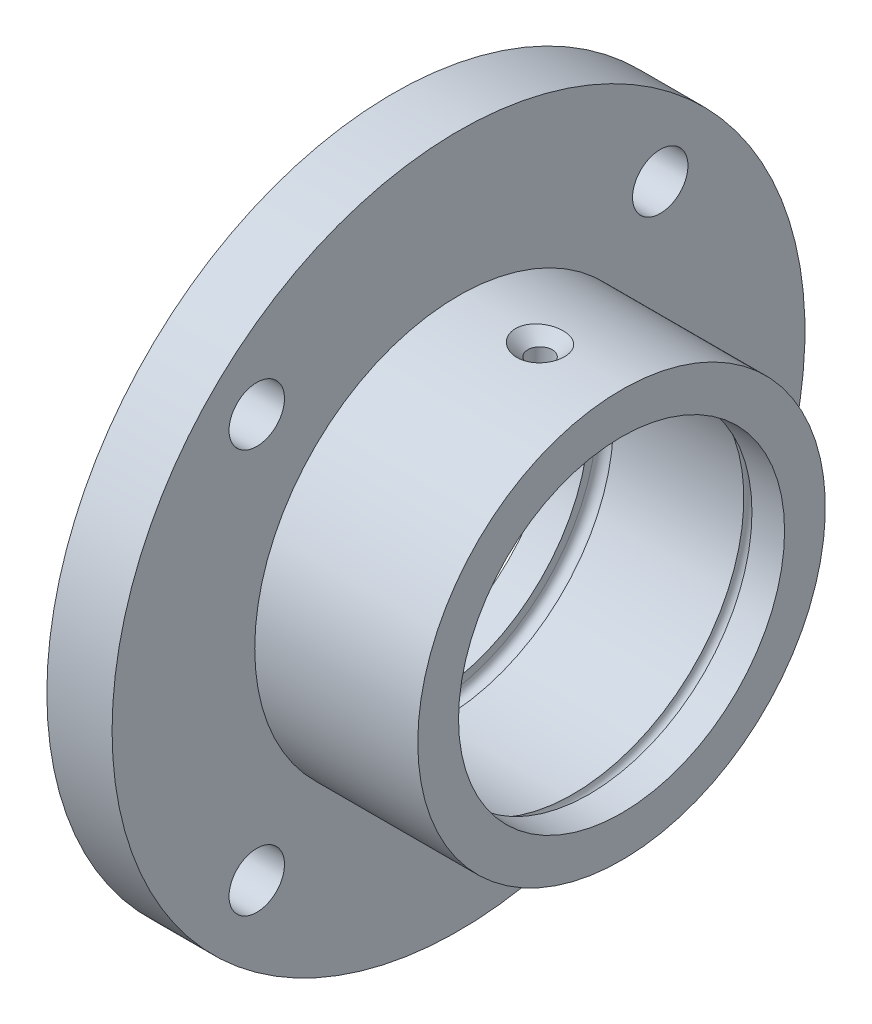
ISO-10303-21;
HEADER;
FILE_DESCRIPTION(('STEP AP214'),'2;1');
FILE_NAME('part.step','',(''),(''),'','','');
FILE_SCHEMA(('AUTOMOTIVE_DESIGN { 1 0 10303 214 1 1 1 1 }'));
ENDSEC;
DATA;
#1=APPLICATION_CONTEXT('core data for automotive mechanical design processes');
#2=APPLICATION_PROTOCOL_DEFINITION('international standard','automotive_design',2000,#1);
#3=PRODUCT_CONTEXT('',#1,'mechanical');
#4=PRODUCT('Part','Part','',(#3));
#5=PRODUCT_RELATED_PRODUCT_CATEGORY('part','',(#4));
#6=PRODUCT_DEFINITION_FORMATION('','',#4);
#7=PRODUCT_DEFINITION_CONTEXT('part definition',#1,'design');
#8=PRODUCT_DEFINITION('design','',#6,#7);
#9=PRODUCT_DEFINITION_SHAPE('','',#8);
#10=(LENGTH_UNIT() NAMED_UNIT(*) SI_UNIT(.MILLI.,.METRE.));
#11=(NAMED_UNIT(*) PLANE_ANGLE_UNIT() SI_UNIT($,.RADIAN.));
#12=(NAMED_UNIT(*) SI_UNIT($,.STERADIAN.) SOLID_ANGLE_UNIT());
#13=UNCERTAINTY_MEASURE_WITH_UNIT(LENGTH_MEASURE(1.E-05),#10,'distance_accuracy_value','');
#14=(GEOMETRIC_REPRESENTATION_CONTEXT(3) GLOBAL_UNCERTAINTY_ASSIGNED_CONTEXT((#13)) GLOBAL_UNIT_ASSIGNED_CONTEXT((#10,
#11,#12)) REPRESENTATION_CONTEXT('',''));
#15=CARTESIAN_POINT('',(0.,0.,0.));
#16=DIRECTION('',(0.,0.,1.));
#17=DIRECTION('',(1.,0.,0.));
#18=AXIS2_PLACEMENT_3D('',#15,#16,#17);
#19=CARTESIAN_POINT('',(0.,0.,0.));
#20=DIRECTION('',(1.,0.,0.));
#21=DIRECTION('',(0.,0.,-1.));
#22=AXIS2_PLACEMENT_3D('',#19,#20,#21);
#23=PLANE('',#22);
#24=CARTESIAN_POINT('',(0.,-24.748737341529,24.7487373415293));
#25=DIRECTION('',(-1.,0.,0.));
#26=DIRECTION('',(0.,0.,1.));
#27=AXIS2_PLACEMENT_3D('',#24,#25,#26);
#28=CIRCLE('',#27,4.025);
#29=CARTESIAN_POINT('',(0.,-24.748737341529,28.7737373415293));
#30=VERTEX_POINT('',#29);
#31=EDGE_CURVE('E180',#30,#30,#28,.T.);
#32=ORIENTED_EDGE('',*,*,#31,.F.);
#33=EDGE_LOOP('',(#32));
#34=FACE_BOUND('',#33,.T.);
#35=CARTESIAN_POINT('',(0.,-24.748737341529,-24.7487373415293));
#36=DIRECTION('',(-1.,0.,0.));
#37=DIRECTION('',(0.,0.,1.));
#38=AXIS2_PLACEMENT_3D('',#35,#36,#37);
#39=CIRCLE('',#38,4.025);
#40=CARTESIAN_POINT('',(0.,-24.748737341529,-20.7237373415293));
#41=VERTEX_POINT('',#40);
#42=EDGE_CURVE('E184',#41,#41,#39,.T.);
#43=ORIENTED_EDGE('',*,*,#42,.F.);
#44=EDGE_LOOP('',(#43));
#45=FACE_BOUND('',#44,.T.);
#46=CARTESIAN_POINT('',(0.,24.7487373415292,-24.7487373415291));
#47=DIRECTION('',(-1.,0.,0.));
#48=DIRECTION('',(0.,0.,1.));
#49=AXIS2_PLACEMENT_3D('',#46,#47,#48);
#50=CIRCLE('',#49,4.025);
#51=CARTESIAN_POINT('',(0.,24.7487373415292,-20.7237373415291));
#52=VERTEX_POINT('',#51);
#53=EDGE_CURVE('E188',#52,#52,#50,.T.);
#54=ORIENTED_EDGE('',*,*,#53,.F.);
#55=EDGE_LOOP('',(#54));
#56=FACE_BOUND('',#55,.T.);
#57=CARTESIAN_POINT('',(0.,24.748737341529,24.7487373415293));
#58=DIRECTION('',(-1.,0.,0.));
#59=DIRECTION('',(0.,0.,1.));
#60=AXIS2_PLACEMENT_3D('',#57,#58,#59);
#61=CIRCLE('',#60,4.025);
#62=CARTESIAN_POINT('',(0.,24.748737341529,28.7737373415293));
#63=VERTEX_POINT('',#62);
#64=EDGE_CURVE('E192',#63,#63,#61,.T.);
#65=ORIENTED_EDGE('',*,*,#64,.F.);
#66=EDGE_LOOP('',(#65));
#67=FACE_BOUND('',#66,.T.);
#68=CARTESIAN_POINT('',(0.,0.,0.));
#69=DIRECTION('',(-1.,0.,0.));
#70=DIRECTION('',(0.,0.,1.));
#71=AXIS2_PLACEMENT_3D('',#68,#69,#70);
#72=CIRCLE('',#71,20.);
#73=CARTESIAN_POINT('',(0.,0.,20.));
#74=VERTEX_POINT('',#73);
#75=EDGE_CURVE('E103',#74,#74,#72,.T.);
#76=ORIENTED_EDGE('',*,*,#75,.F.);
#77=EDGE_LOOP('',(#76));
#78=FACE_BOUND('',#77,.T.);
#79=CARTESIAN_POINT('',(0.,0.,0.));
#80=DIRECTION('',(-1.,0.,0.));
#81=DIRECTION('',(0.,0.,1.));
#82=AXIS2_PLACEMENT_3D('',#79,#80,#81);
#83=CIRCLE('',#82,42.5);
#84=CARTESIAN_POINT('',(0.,0.,42.5));
#85=VERTEX_POINT('',#84);
#86=EDGE_CURVE('E57',#85,#85,#83,.T.);
#87=ORIENTED_EDGE('',*,*,#86,.T.);
#88=EDGE_LOOP('',(#87));
#89=FACE_BOUND('',#88,.T.);
#90=ADVANCED_FACE('F49',(#34,#45,#56,#67,#78,#89),#23,.F.);
#91=CARTESIAN_POINT('',(0.,0.,0.));
#92=DIRECTION('',(-1.,0.,0.));
#93=DIRECTION('',(0.,0.,1.));
#94=AXIS2_PLACEMENT_3D('',#91,#92,#93);
#95=CYLINDRICAL_SURFACE('',#94,42.5);
#96=ORIENTED_EDGE('',*,*,#86,.F.);
#97=EDGE_LOOP('',(#96));
#98=FACE_BOUND('',#97,.T.);
#99=CARTESIAN_POINT('',(8.,0.,0.));
#100=DIRECTION('',(-1.,0.,0.));
#101=DIRECTION('',(0.,0.,1.));
#102=AXIS2_PLACEMENT_3D('',#99,#100,#101);
#103=CIRCLE('',#102,42.5);
#104=CARTESIAN_POINT('',(8.,0.,42.5));
#105=VERTEX_POINT('',#104);
#106=EDGE_CURVE('E63',#105,#105,#103,.T.);
#107=ORIENTED_EDGE('',*,*,#106,.T.);
#108=EDGE_LOOP('',(#107));
#109=FACE_BOUND('',#108,.T.);
#110=ADVANCED_FACE('F148',(#98,#109),#95,.T.);
#111=CARTESIAN_POINT('',(8.,42.5,0.));
#112=DIRECTION('',(-1.,0.,0.));
#113=DIRECTION('',(0.,0.,1.));
#114=AXIS2_PLACEMENT_3D('',#111,#112,#113);
#115=PLANE('',#114);
#116=CARTESIAN_POINT('',(8.,-24.748737341529,24.7487373415293));
#117=DIRECTION('',(-1.,0.,0.));
#118=DIRECTION('',(0.,0.,1.));
#119=AXIS2_PLACEMENT_3D('',#116,#117,#118);
#120=CIRCLE('',#119,3.39999999999999);
#121=CARTESIAN_POINT('',(8.,-24.748737341529,28.1487373415293));
#122=VERTEX_POINT('',#121);
#123=EDGE_CURVE('E52',#122,#122,#120,.T.);
#124=ORIENTED_EDGE('',*,*,#123,.T.);
#125=EDGE_LOOP('',(#124));
#126=FACE_BOUND('',#125,.T.);
#127=CARTESIAN_POINT('',(8.,-24.748737341529,-24.7487373415293));
#128=DIRECTION('',(-1.,0.,0.));
#129=DIRECTION('',(0.,0.,1.));
#130=AXIS2_PLACEMENT_3D('',#127,#128,#129);
#131=CIRCLE('',#130,3.39999999999999);
#132=CARTESIAN_POINT('',(8.,-24.748737341529,-21.3487373415293));
#133=VERTEX_POINT('',#132);
#134=EDGE_CURVE('E420',#133,#133,#131,.T.);
#135=ORIENTED_EDGE('',*,*,#134,.T.);
#136=EDGE_LOOP('',(#135));
#137=FACE_BOUND('',#136,.T.);
#138=CARTESIAN_POINT('',(8.,24.7487373415292,-24.7487373415291));
#139=DIRECTION('',(-1.,0.,0.));
#140=DIRECTION('',(0.,0.,1.));
#141=AXIS2_PLACEMENT_3D('',#138,#139,#140);
#142=CIRCLE('',#141,3.39999999999999);
#143=CARTESIAN_POINT('',(8.,24.7487373415292,-21.3487373415291));
#144=VERTEX_POINT('',#143);
#145=EDGE_CURVE('E428',#144,#144,#142,.T.);
#146=ORIENTED_EDGE('',*,*,#145,.T.);
#147=EDGE_LOOP('',(#146));
#148=FACE_BOUND('',#147,.T.);
#149=CARTESIAN_POINT('',(8.,24.748737341529,24.7487373415293));
#150=DIRECTION('',(-1.,0.,0.));
#151=DIRECTION('',(0.,0.,1.));
#152=AXIS2_PLACEMENT_3D('',#149,#150,#151);
#153=CIRCLE('',#152,3.39999999999999);
#154=CARTESIAN_POINT('',(8.,24.748737341529,28.1487373415293));
#155=VERTEX_POINT('',#154);
#156=EDGE_CURVE('E72',#155,#155,#153,.T.);
#157=ORIENTED_EDGE('',*,*,#156,.T.);
#158=EDGE_LOOP('',(#157));
#159=FACE_BOUND('',#158,.T.);
#160=ORIENTED_EDGE('',*,*,#106,.F.);
#161=EDGE_LOOP('',(#160));
#162=FACE_BOUND('',#161,.T.);
#163=CARTESIAN_POINT('',(8.,0.,0.));
#164=DIRECTION('',(-1.,0.,0.));
#165=DIRECTION('',(0.,0.,1.));
#166=AXIS2_PLACEMENT_3D('',#163,#164,#165);
#167=CIRCLE('',#166,25.);
#168=CARTESIAN_POINT('',(8.,0.,25.));
#169=VERTEX_POINT('',#168);
#170=EDGE_CURVE('E141',#169,#169,#167,.T.);
#171=ORIENTED_EDGE('',*,*,#170,.T.);
#172=EDGE_LOOP('',(#171));
#173=FACE_BOUND('',#172,.T.);
#174=ADVANCED_FACE('F150',(#126,#137,#148,#159,#162,#173),#115,.F.);
#175=CARTESIAN_POINT('',(0.,0.,0.));
#176=DIRECTION('',(-1.,0.,0.));
#177=DIRECTION('',(0.,0.,1.));
#178=AXIS2_PLACEMENT_3D('',#175,#176,#177);
#179=CYLINDRICAL_SURFACE('',#178,25.);
#180=CARTESIAN_POINT('',(15.9365317259917,24.9150620153961,-2.05904957922023));
#181=CARTESIAN_POINT('',(16.0437107225847,24.9071157754306,-2.15520477172809));
#182=CARTESIAN_POINT('',(16.1579825974758,24.8992581419658,-2.24351052359883));
#183=CARTESIAN_POINT('',(16.3980646835025,24.8843774220917,-2.40295373031443));
#184=CARTESIAN_POINT('',(16.5238852496452,24.8773550978627,-2.47407556573222));
#185=CARTESIAN_POINT('',(16.8068841112376,24.8636282056974,-2.60870980980574));
#186=CARTESIAN_POINT('',(16.9657239841346,24.8571882442472,-2.66878347370037));
#187=CARTESIAN_POINT('',(17.2911168596524,24.8469504704821,-2.76247739758651));
#188=CARTESIAN_POINT('',(17.457672671191,24.8431536285613,-2.79608794250703));
#189=CARTESIAN_POINT('',(17.7994490402391,24.8385356387127,-2.83682898059478));
#190=CARTESIAN_POINT('',(17.9747764744444,24.8378133443776,-2.84307997726629));
#191=CARTESIAN_POINT('',(18.3240438227202,24.8396982272045,-2.82656234622219));
#192=CARTESIAN_POINT('',(18.4979836637103,24.8423055785792,-2.80379220007158));
#193=CARTESIAN_POINT('',(18.8412833945559,24.8505963405152,-2.72933520161493));
#194=CARTESIAN_POINT('',(19.0105821305259,24.8563094812074,-2.67736870386898));
#195=CARTESIAN_POINT('',(19.3378136198523,24.8701666979042,-2.54542430653609));
#196=CARTESIAN_POINT('',(19.4957463299609,24.8783107831581,-2.46544630037167));
#197=CARTESIAN_POINT('',(19.7929362610855,24.8959167385213,-2.28073929385836));
#198=CARTESIAN_POINT('',(19.9324463082021,24.9053560780482,-2.17641571982751));
#199=CARTESIAN_POINT('',(20.1909545204536,24.9245058909376,-1.94485304006585));
#200=CARTESIAN_POINT('',(20.3099573658651,24.9342163018453,-1.81761917665012));
#201=CARTESIAN_POINT('',(20.5184560288595,24.9522818566562,-1.54947724710471));
#202=CARTESIAN_POINT('',(20.6089925083573,24.9606771026206,-1.4093821252976));
#203=CARTESIAN_POINT('',(20.7636454066142,24.9755470357339,-1.11520078611881));
#204=CARTESIAN_POINT('',(20.827772635022,24.9820225083663,-0.961120324707263));
#205=CARTESIAN_POINT('',(20.924023156465,24.9919220495399,-0.652864740939115));
#206=CARTESIAN_POINT('',(20.9577691972872,24.9954996530923,-0.499200552385913));
#207=CARTESIAN_POINT('',(20.9979526060761,24.999773360494,-0.188314042065934));
#208=CARTESIAN_POINT('',(21.0043975479152,25.000470263506,-0.031092719289181));
#209=CARTESIAN_POINT('',(20.990011586111,24.998930975301,0.27586060065357));
#210=CARTESIAN_POINT('',(20.9702418009793,24.9968088849899,0.425644259255815));
#211=CARTESIAN_POINT('',(20.9060475966515,24.9900699789283,0.719755865863189));
#212=CARTESIAN_POINT('',(20.8616235630407,24.9854532021941,0.864083899155021));
#213=CARTESIAN_POINT('',(20.7495442996481,24.9742070685698,1.14398635922683));
#214=CARTESIAN_POINT('',(20.6817951565278,24.9675695884702,1.27952272539249));
#215=CARTESIAN_POINT('',(20.5254376016767,24.9529897989429,1.53787864201499));
#216=CARTESIAN_POINT('',(20.4368256129636,24.9450472658315,1.66069600656503));
#217=CARTESIAN_POINT('',(20.2373261918551,24.9283063211985,1.89579494357404));
#218=CARTESIAN_POINT('',(20.1256518890108,24.9194858783553,2.00740659367369));
#219=CARTESIAN_POINT('',(19.8859779632359,24.9022068638707,2.2114714942394));
#220=CARTESIAN_POINT('',(19.7579742717448,24.8937483831182,2.30391995496766));
#221=CARTESIAN_POINT('',(19.4817138042694,24.8775995185179,2.47237058797334));
#222=CARTESIAN_POINT('',(19.332730172835,24.8699770073704,2.54718792371623));
#223=CARTESIAN_POINT('',(19.0246144250399,24.8568788688926,2.67198870486551));
#224=CARTESIAN_POINT('',(18.8654801112175,24.8514037082761,2.72196675223152));
#225=CARTESIAN_POINT('',(18.5344269278615,24.8429973188166,2.79768096292758));
#226=CARTESIAN_POINT('',(18.362251781182,24.8401823898802,2.82231273173568));
#227=CARTESIAN_POINT('',(18.0161612346533,24.837816060436,2.8430619243428));
#228=CARTESIAN_POINT('',(17.8422456068629,24.8382650931279,2.83917556315646));
#229=CARTESIAN_POINT('',(17.4943560783235,24.8424148858173,2.80263593546425));
#230=CARTESIAN_POINT('',(17.3204360685027,24.8461732917597,2.76947266806419));
#231=CARTESIAN_POINT('',(16.9807170973922,24.8565890306788,2.67436949906663));
#232=CARTESIAN_POINT('',(16.8149184307397,24.8632464687442,2.61242855428655));
#233=CARTESIAN_POINT('',(16.4975641117529,24.8786239547148,2.46165534522482));
#234=CARTESIAN_POINT('',(16.3459153066075,24.8873289525357,2.37301803230034));
#235=CARTESIAN_POINT('',(16.0603819744962,24.9057879944435,2.17071443482601));
#236=CARTESIAN_POINT('',(15.9264949225068,24.9155418890608,2.05705171402924));
#237=CARTESIAN_POINT('',(15.6853897571733,24.9345527403733,1.81180935089952));
#238=CARTESIAN_POINT('',(15.5774189869573,24.9438153109391,1.68097128066994));
#239=CARTESIAN_POINT('',(15.3864939023304,24.9610424510707,1.40207458690901));
#240=CARTESIAN_POINT('',(15.3035301634539,24.9690075091121,1.25402248010065));
#241=CARTESIAN_POINT('',(15.1698747249061,24.9822289744927,0.953702214091301));
#242=CARTESIAN_POINT('',(15.1176499592277,24.9876109811195,0.802121862586169));
#243=CARTESIAN_POINT('',(15.0407471012562,24.9956369087427,0.49206916843793));
#244=CARTESIAN_POINT('',(15.0160587449811,24.9982818499324,0.333599416664387));
#245=CARTESIAN_POINT('',(14.9957909103458,25.0004497576838,0.0226257576214688));
#246=CARTESIAN_POINT('',(14.9988428502662,25.0001195139069,-0.129789443680718));
#247=CARTESIAN_POINT('',(15.0306736328937,24.9967256068,-0.431884818168033));
#248=CARTESIAN_POINT('',(15.0594533489792,24.9936618506758,-0.581564898328254));
#249=CARTESIAN_POINT('',(15.141155819879,24.9851956437949,-0.872328260279819));
#250=CARTESIAN_POINT('',(15.1938150825195,24.9798187491079,-1.01348679670247));
#251=CARTESIAN_POINT('',(15.3212820682627,24.9673113294873,-1.28525131875912));
#252=CARTESIAN_POINT('',(15.3960788761386,24.9601816690721,-1.41586246462921));
#253=CARTESIAN_POINT('',(15.5458547203065,24.9466602813832,-1.63502521748294));
#254=CARTESIAN_POINT('',(15.6168499963501,24.9404748936676,-1.72634893679647));
#255=CARTESIAN_POINT('',(15.7692226141498,24.927861313931,-1.89981210369311));
#256=CARTESIAN_POINT('',(15.8505973144017,24.9214331839785,-1.98195387808345));
#257=CARTESIAN_POINT('',(15.9365317259917,24.9150620153961,-2.05904957922023));
#258=B_SPLINE_CURVE_WITH_KNOTS('',3,(#180,#181,#182,#183,#184,#185,#186,#187,#188,#189,#190,
#191,#192,#193,#194,#195,#196,#197,#198,#199,#200,#201,#202,#203,#204,#205,#206,#207,#208,#209,
#210,#211,#212,#213,#214,#215,#216,#217,#218,#219,#220,#221,#222,#223,#224,#225,#226,#227,#228,
#229,#230,#231,#232,#233,#234,#235,#236,#237,#238,#239,#240,#241,#242,#243,#244,#245,#246,#247,
#248,#249,#250,#251,#252,#253,#254,#255,#256,#257),.UNSPECIFIED.,.T.,.F.,(4,2,2,2,2,2,2,2,2,2,2,
2,2,2,2,2,2,2,2,2,2,2,2,2,2,2,2,2,2,2,2,2,2,2,2,2,2,2,4),(0.,0.432311368923575,
0.865014223971844,1.37249013784755,1.88015226819742,2.40401911414544,2.92791337081323,
3.45691324391731,3.9859151297687,4.50666754981526,5.02730096275976,5.52576549483266,
6.02402579564198,6.49374647988661,6.963336845655,7.41448753769496,7.86563117406685,
8.31861290320379,8.77167235371786,9.24399357654019,9.71643271158111,10.2148672532511,
10.7134100667266,11.2328579143695,11.7523747054548,12.2811240393082,12.8098925416694,
13.3348896421596,13.8598120285305,14.3668665347407,14.8737297063696,15.3525165228815,
15.831124815636,16.286253981409,16.7413985979928,17.1916388550977,17.6416574837231,
17.9883659104411,18.3349862772387),.UNSPECIFIED.);
#259=CARTESIAN_POINT('',(15.9365317259917,24.9150620153961,-2.05904957922023));
#260=VERTEX_POINT('',#259);
#261=EDGE_CURVE('E10',#260,#260,#258,.T.);
#262=ORIENTED_EDGE('',*,*,#261,.T.);
#263=EDGE_LOOP('',(#262));
#264=FACE_BOUND('',#263,.T.);
#265=ORIENTED_EDGE('',*,*,#170,.F.);
#266=EDGE_LOOP('',(#265));
#267=FACE_BOUND('',#266,.T.);
#268=CARTESIAN_POINT('',(28.,0.,0.));
#269=DIRECTION('',(-1.,0.,0.));
#270=DIRECTION('',(0.,0.,1.));
#271=AXIS2_PLACEMENT_3D('',#268,#269,#270);
#272=CIRCLE('',#271,25.);
#273=CARTESIAN_POINT('',(28.,0.,25.));
#274=VERTEX_POINT('',#273);
#275=EDGE_CURVE('E137',#274,#274,#272,.T.);
#276=ORIENTED_EDGE('',*,*,#275,.T.);
#277=EDGE_LOOP('',(#276));
#278=FACE_BOUND('',#277,.T.);
#279=ADVANCED_FACE('F74',(#264,#267,#278),#179,.T.);
#280=CARTESIAN_POINT('',(28.,25.,0.));
#281=DIRECTION('',(-1.,0.,0.));
#282=DIRECTION('',(0.,0.,1.));
#283=AXIS2_PLACEMENT_3D('',#280,#281,#282);
#284=PLANE('',#283);
#285=CARTESIAN_POINT('',(28.,0.,0.));
#286=DIRECTION('',(-1.,0.,0.));
#287=DIRECTION('',(0.,0.,1.));
#288=AXIS2_PLACEMENT_3D('',#285,#286,#287);
#289=CIRCLE('',#288,20.);
#290=CARTESIAN_POINT('',(28.,0.,20.));
#291=VERTEX_POINT('',#290);
#292=EDGE_CURVE('E133',#291,#291,#289,.T.);
#293=ORIENTED_EDGE('',*,*,#292,.T.);
#294=EDGE_LOOP('',(#293));
#295=FACE_BOUND('',#294,.T.);
#296=ORIENTED_EDGE('',*,*,#275,.F.);
#297=EDGE_LOOP('',(#296));
#298=FACE_BOUND('',#297,.T.);
#299=ADVANCED_FACE('F158',(#295,#298),#284,.F.);
#300=CARTESIAN_POINT('',(0.,0.,0.));
#301=DIRECTION('',(-1.,0.,0.));
#302=DIRECTION('',(0.,0.,1.));
#303=AXIS2_PLACEMENT_3D('',#300,#301,#302);
#304=CYLINDRICAL_SURFACE('',#303,20.);
#305=CARTESIAN_POINT('',(24.,0.,0.));
#306=DIRECTION('',(-1.,0.,0.));
#307=DIRECTION('',(0.,0.,1.));
#308=AXIS2_PLACEMENT_3D('',#305,#306,#307);
#309=CIRCLE('',#308,20.);
#310=CARTESIAN_POINT('',(24.,0.,20.));
#311=VERTEX_POINT('',#310);
#312=EDGE_CURVE('E129',#311,#311,#309,.T.);
#313=ORIENTED_EDGE('',*,*,#312,.T.);
#314=EDGE_LOOP('',(#313));
#315=FACE_BOUND('',#314,.T.);
#316=ORIENTED_EDGE('',*,*,#292,.F.);
#317=EDGE_LOOP('',(#316));
#318=FACE_BOUND('',#317,.T.);
#319=ADVANCED_FACE('F162',(#315,#318),#304,.F.);
#320=CARTESIAN_POINT('',(24.,21.,0.));
#321=DIRECTION('',(-1.,0.,0.));
#322=DIRECTION('',(0.,0.,1.));
#323=AXIS2_PLACEMENT_3D('',#320,#321,#322);
#324=PLANE('',#323);
#325=CARTESIAN_POINT('',(24.,0.,0.));
#326=DIRECTION('',(-1.,0.,0.));
#327=DIRECTION('',(0.,0.,1.));
#328=AXIS2_PLACEMENT_3D('',#325,#326,#327);
#329=CIRCLE('',#328,21.);
#330=CARTESIAN_POINT('',(24.,0.,21.));
#331=VERTEX_POINT('',#330);
#332=EDGE_CURVE('E125',#331,#331,#329,.T.);
#333=ORIENTED_EDGE('',*,*,#332,.T.);
#334=EDGE_LOOP('',(#333));
#335=FACE_BOUND('',#334,.T.);
#336=ORIENTED_EDGE('',*,*,#312,.F.);
#337=EDGE_LOOP('',(#336));
#338=FACE_BOUND('',#337,.T.);
#339=ADVANCED_FACE('F168',(#335,#338),#324,.T.);
#340=CARTESIAN_POINT('',(23.,0.,0.));
#341=DIRECTION('',(-1.,0.,0.));
#342=DIRECTION('',(0.,0.,1.));
#343=AXIS2_PLACEMENT_3D('',#340,#341,#342);
#344=TOROIDAL_SURFACE('',#343,21.,1.);
#345=CARTESIAN_POINT('',(22.,0.,0.));
#346=DIRECTION('',(-1.,0.,0.));
#347=DIRECTION('',(0.,0.,1.));
#348=AXIS2_PLACEMENT_3D('',#345,#346,#347);
#349=CIRCLE('',#348,21.);
#350=CARTESIAN_POINT('',(22.,0.,21.));
#351=VERTEX_POINT('',#350);
#352=EDGE_CURVE('E121',#351,#351,#349,.T.);
#353=ORIENTED_EDGE('',*,*,#352,.T.);
#354=EDGE_LOOP('',(#353));
#355=FACE_BOUND('',#354,.T.);
#356=ORIENTED_EDGE('',*,*,#332,.F.);
#357=EDGE_LOOP('',(#356));
#358=FACE_BOUND('',#357,.T.);
#359=ADVANCED_FACE('F216',(#355,#358),#344,.F.);
#360=CARTESIAN_POINT('',(0.,0.,0.));
#361=DIRECTION('',(-1.,0.,0.));
#362=DIRECTION('',(0.,0.,1.));
#363=AXIS2_PLACEMENT_3D('',#360,#361,#362);
#364=CYLINDRICAL_SURFACE('',#363,21.);
#365=CARTESIAN_POINT('',(18.,20.9463600656534,1.49999999999999));
#366=CARTESIAN_POINT('',(17.9158597293712,20.9463607805905,1.49999630773253));
#367=CARTESIAN_POINT('',(17.8316611861164,20.9468724996349,1.49289661360653));
#368=CARTESIAN_POINT('',(17.6655908916451,20.9488642225792,1.46467748578045));
#369=CARTESIAN_POINT('',(17.5837219338416,20.9503453417278,1.44354190404921));
#370=CARTESIAN_POINT('',(17.4247402815898,20.9541072519724,1.38786284043581));
#371=CARTESIAN_POINT('',(17.347625029728,20.9563876085984,1.35332664211386));
#372=CARTESIAN_POINT('',(17.2003055697059,20.9614905050274,1.27183896327473));
#373=CARTESIAN_POINT('',(17.1300998252404,20.9643129238909,1.22489025123434));
#374=CARTESIAN_POINT('',(16.9984378898784,20.9701880394536,1.11981206149728));
#375=CARTESIAN_POINT('',(16.9369967732085,20.9732411193969,1.06166371574801));
#376=CARTESIAN_POINT('',(16.8247374221953,20.9792300094627,0.935876318394208));
#377=CARTESIAN_POINT('',(16.7739196391206,20.9821658145991,0.868236863820637));
#378=CARTESIAN_POINT('',(16.6843013651431,20.9875928271288,0.725299939743739));
#379=CARTESIAN_POINT('',(16.6455136110344,20.9900835621299,0.649994465085942));
#380=CARTESIAN_POINT('',(16.5811379412121,20.9943357099552,0.493919162487952));
#381=CARTESIAN_POINT('',(16.5555498489383,20.9960971325347,0.413149407654984));
#382=CARTESIAN_POINT('',(16.5183424068555,20.9986895265493,0.248585804090435));
#383=CARTESIAN_POINT('',(16.5066990791172,20.9995220949736,0.164797402265964));
#384=CARTESIAN_POINT('',(16.4976375985773,21.0001683650842,-0.00354834211803047));
#385=CARTESIAN_POINT('',(16.5002192443684,20.9999820811961,-0.088105673773574));
#386=CARTESIAN_POINT('',(16.5195147189867,20.9986129624613,-0.255426528240718));
#387=CARTESIAN_POINT('',(16.5362027591525,20.9974319461528,-0.338193041951438));
#388=CARTESIAN_POINT('',(16.5831972589989,20.9942083677994,-0.49974713764118));
#389=CARTESIAN_POINT('',(16.6135038187397,20.9921657994245,-0.578534690380599));
#390=CARTESIAN_POINT('',(16.6869040873632,20.9874458886838,-0.729976881063218));
#391=CARTESIAN_POINT('',(16.7300094291142,20.9847679692916,-0.802625862132503));
#392=CARTESIAN_POINT('',(16.8277752053522,20.9790785643045,-0.939666911300929));
#393=CARTESIAN_POINT('',(16.8824358109902,20.9760670737693,-1.00405885707805));
#394=CARTESIAN_POINT('',(17.0019060313855,20.9700413209371,-1.12290860736674));
#395=CARTESIAN_POINT('',(17.0667380395321,20.9670270674706,-1.17734390455588));
#396=CARTESIAN_POINT('',(17.2046324322745,20.9613423266833,-1.27456146765125));
#397=CARTESIAN_POINT('',(17.2776948213367,20.9586718395492,-1.31734372723368));
#398=CARTESIAN_POINT('',(17.429990900389,20.9539763253534,-1.3900394754531));
#399=CARTESIAN_POINT('',(17.5092250858981,20.9519513501849,-1.41995192954331));
#400=CARTESIAN_POINT('',(17.6716086477656,20.9487769654736,-1.46604298176618));
#401=CARTESIAN_POINT('',(17.7547579638365,20.9476275424532,-1.48222179130446));
#402=CARTESIAN_POINT('',(17.9224149122973,20.9463364298212,-1.50035807896062));
#403=CARTESIAN_POINT('',(18.0069191396525,20.9461925204491,-1.50234688297968));
#404=CARTESIAN_POINT('',(18.175059903757,20.9469228612486,-1.49212863499684));
#405=CARTESIAN_POINT('',(18.2586964464218,20.9477971044742,-1.4799216798405));
#406=CARTESIAN_POINT('',(18.4226385944868,20.9504632107155,-1.44168448277707));
#407=CARTESIAN_POINT('',(18.5029475994235,20.9522541109385,-1.4156687435948));
#408=CARTESIAN_POINT('',(18.6580600737612,20.9565509164796,-1.35056717960682));
#409=CARTESIAN_POINT('',(18.7328634780003,20.9590568302585,-1.31148120013789));
#410=CARTESIAN_POINT('',(18.8749850385802,20.9645066729767,-1.22126891967116));
#411=CARTESIAN_POINT('',(18.9422898705884,20.96745136055,-1.17012167386025));
#412=CARTESIAN_POINT('',(19.0673693515948,20.9734443165159,-1.05726913394559));
#413=CARTESIAN_POINT('',(19.1251438795493,20.9764925862235,-0.995563705763443));
#414=CARTESIAN_POINT('',(19.2296289987268,20.9823557686753,-0.863211351780245));
#415=CARTESIAN_POINT('',(19.2763192864152,20.9851702471375,-0.792548375559797));
#416=CARTESIAN_POINT('',(19.3571714803644,20.9902424800916,-0.644367203480496));
#417=CARTESIAN_POINT('',(19.391333482961,20.9925002388643,-0.566849060339878));
#418=CARTESIAN_POINT('',(19.4461242304609,20.996202602312,-0.407231907053549));
#419=CARTESIAN_POINT('',(19.4667657089324,20.9976479719088,-0.325137286330011));
#420=CARTESIAN_POINT('',(19.4939711231601,20.9995657760209,-0.158636845984748));
#421=CARTESIAN_POINT('',(19.5005352477279,21.0000382235855,-0.0742310573767892));
#422=CARTESIAN_POINT('',(19.4993976627834,20.9999569843448,0.0942951309044647));
#423=CARTESIAN_POINT('',(19.4917276741879,20.999405579208,0.178415747631057));
#424=CARTESIAN_POINT('',(19.4624055067654,20.9973431384145,0.344171230001304));
#425=CARTESIAN_POINT('',(19.4407533052676,20.9958321012019,0.425806091614303));
#426=CARTESIAN_POINT('',(19.3840888889982,20.9920201113399,0.584276369123835));
#427=CARTESIAN_POINT('',(19.3490769944282,20.9897191776226,0.661111899998099));
#428=CARTESIAN_POINT('',(19.2666910470801,20.984585372307,0.807818851611434));
#429=CARTESIAN_POINT('',(19.2193172653825,20.9817525123735,0.877690425014833));
#430=CARTESIAN_POINT('',(19.1134339457421,20.975865725958,1.00864777891551));
#431=CARTESIAN_POINT('',(19.0549011784183,20.9728113467116,1.06971475693763));
#432=CARTESIAN_POINT('',(18.9283983768498,20.9668295331428,1.18117903752931));
#433=CARTESIAN_POINT('',(18.8604260463359,20.9639021299367,1.23157373640452));
#434=CARTESIAN_POINT('',(18.7168748537556,20.9585009277241,1.32031221226757));
#435=CARTESIAN_POINT('',(18.6412848370487,20.956027809327,1.35863796794652));
#436=CARTESIAN_POINT('',(18.4847787175927,20.9518237120507,1.42200600394629));
#437=CARTESIAN_POINT('',(18.4038689316627,20.9500918706859,1.44706372988661));
#438=CARTESIAN_POINT('',(18.2687257766423,20.9480169655908,1.47672298035906));
#439=CARTESIAN_POINT('',(18.2153643312081,20.9473984358357,1.48544045174428));
#440=CARTESIAN_POINT('',(18.1080099286975,20.9465697567603,1.49708014131631));
#441=CARTESIAN_POINT('',(18.0540169728075,20.946359606673,1.50000237038827));
#442=CARTESIAN_POINT('',(18.,20.9463600656534,1.49999999999999));
#443=B_SPLINE_CURVE_WITH_KNOTS('',3,(#365,#366,#367,#368,#369,#370,#371,#372,#373,#374,#375,
#376,#377,#378,#379,#380,#381,#382,#383,#384,#385,#386,#387,#388,#389,#390,#391,#392,#393,#394,
#395,#396,#397,#398,#399,#400,#401,#402,#403,#404,#405,#406,#407,#408,#409,#410,#411,#412,#413,
#414,#415,#416,#417,#418,#419,#420,#421,#422,#423,#424,#425,#426,#427,#428,#429,#430,#431,#432,
#433,#434,#435,#436,#437,#438,#439,#440,#441,#442),.UNSPECIFIED.,.T.,.F.,(4,2,2,2,2,2,2,2,2,2,2,
2,2,2,2,2,2,2,2,2,2,2,2,2,2,2,2,2,2,2,2,2,2,2,2,2,2,2,4),(0.,0.252223604604446,
0.504737891716924,0.757115123008722,1.00943611170945,1.26218596442171,1.51494655151743,
1.76797384250599,2.02099774888284,2.27358595482366,2.52617058444974,2.77829444665465,
3.03042016133545,3.28277573933269,3.53513505536404,3.7880579714211,4.04098102473252,
4.29392440561326,4.54686389279883,4.79924481671065,5.05162401885271,5.30373868178785,
5.55585632816032,5.80841505230084,6.0609769839234,6.31399803607582,6.56701714259167,
6.81979761292773,7.07257469284092,7.32478913188565,7.5770039798745,7.82921278322419,
8.08141605641947,8.33415018357382,8.58694589890975,8.84011731752742,9.09299336186854,
9.25491797989124,9.41684229377214),.UNSPECIFIED.);
#444=CARTESIAN_POINT('',(18.,20.9463600656534,1.49999999999999));
#445=VERTEX_POINT('',#444);
#446=EDGE_CURVE('E95',#445,#445,#443,.T.);
#447=ORIENTED_EDGE('',*,*,#446,.F.);
#448=EDGE_LOOP('',(#447));
#449=FACE_BOUND('',#448,.T.);
#450=CARTESIAN_POINT('',(6.,0.,0.));
#451=DIRECTION('',(-1.,0.,0.));
#452=DIRECTION('',(0.,0.,1.));
#453=AXIS2_PLACEMENT_3D('',#450,#451,#452);
#454=CIRCLE('',#453,21.);
#455=CARTESIAN_POINT('',(6.,0.,21.));
#456=VERTEX_POINT('',#455);
#457=EDGE_CURVE('E117',#456,#456,#454,.T.);
#458=ORIENTED_EDGE('',*,*,#457,.T.);
#459=EDGE_LOOP('',(#458));
#460=FACE_BOUND('',#459,.T.);
#461=ORIENTED_EDGE('',*,*,#352,.F.);
#462=EDGE_LOOP('',(#461));
#463=FACE_BOUND('',#462,.T.);
#464=ADVANCED_FACE('F210',(#449,#460,#463),#364,.F.);
#465=CARTESIAN_POINT('',(5.,0.,0.));
#466=DIRECTION('',(-1.,0.,0.));
#467=DIRECTION('',(0.,0.,1.));
#468=AXIS2_PLACEMENT_3D('',#465,#466,#467);
#469=TOROIDAL_SURFACE('',#468,21.,1.);
#470=CARTESIAN_POINT('',(4.,0.,0.));
#471=DIRECTION('',(-1.,0.,0.));
#472=DIRECTION('',(0.,0.,1.));
#473=AXIS2_PLACEMENT_3D('',#470,#471,#472);
#474=CIRCLE('',#473,21.);
#475=CARTESIAN_POINT('',(4.,0.,21.));
#476=VERTEX_POINT('',#475);
#477=EDGE_CURVE('E113',#476,#476,#474,.T.);
#478=ORIENTED_EDGE('',*,*,#477,.T.);
#479=EDGE_LOOP('',(#478));
#480=FACE_BOUND('',#479,.T.);
#481=ORIENTED_EDGE('',*,*,#457,.F.);
#482=EDGE_LOOP('',(#481));
#483=FACE_BOUND('',#482,.T.);
#484=ADVANCED_FACE('F204',(#480,#483),#469,.F.);
#485=CARTESIAN_POINT('',(4.,20.,0.));
#486=DIRECTION('',(1.,0.,0.));
#487=DIRECTION('',(0.,0.,-1.));
#488=AXIS2_PLACEMENT_3D('',#485,#486,#487);
#489=PLANE('',#488);
#490=CARTESIAN_POINT('',(4.,0.,0.));
#491=DIRECTION('',(-1.,0.,0.));
#492=DIRECTION('',(0.,0.,1.));
#493=AXIS2_PLACEMENT_3D('',#490,#491,#492);
#494=CIRCLE('',#493,20.);
#495=CARTESIAN_POINT('',(4.,0.,20.));
#496=VERTEX_POINT('',#495);
#497=EDGE_CURVE('E109',#496,#496,#494,.T.);
#498=ORIENTED_EDGE('',*,*,#497,.T.);
#499=EDGE_LOOP('',(#498));
#500=FACE_BOUND('',#499,.T.);
#501=ORIENTED_EDGE('',*,*,#477,.F.);
#502=EDGE_LOOP('',(#501));
#503=FACE_BOUND('',#502,.T.);
#504=ADVANCED_FACE('F199',(#500,#503),#489,.T.);
#505=CARTESIAN_POINT('',(0.,0.,0.));
#506=DIRECTION('',(-1.,0.,0.));
#507=DIRECTION('',(0.,0.,1.));
#508=AXIS2_PLACEMENT_3D('',#505,#506,#507);
#509=CYLINDRICAL_SURFACE('',#508,20.);
#510=ORIENTED_EDGE('',*,*,#75,.T.);
#511=EDGE_LOOP('',(#510));
#512=FACE_BOUND('',#511,.T.);
#513=ORIENTED_EDGE('',*,*,#497,.F.);
#514=EDGE_LOOP('',(#513));
#515=FACE_BOUND('',#514,.T.);
#516=ADVANCED_FACE('F84',(#512,#515),#509,.F.);
#517=CARTESIAN_POINT('',(18.,25.,0.));
#518=DIRECTION('',(0.,1.,0.));
#519=DIRECTION('',(0.,0.,1.));
#520=AXIS2_PLACEMENT_3D('',#517,#518,#519);
#521=CONICAL_SURFACE('',#520,3.,0.785398163397451);
#522=CARTESIAN_POINT('',(18.,23.5,0.));
#523=DIRECTION('',(0.,1.,0.));
#524=DIRECTION('',(0.,0.,1.));
#525=AXIS2_PLACEMENT_3D('',#522,#523,#524);
#526=CIRCLE('',#525,1.49999999999999);
#527=CARTESIAN_POINT('',(18.,23.5,1.49999999999999));
#528=VERTEX_POINT('',#527);
#529=EDGE_CURVE('E104',#528,#528,#526,.T.);
#530=ORIENTED_EDGE('',*,*,#529,.F.);
#531=EDGE_LOOP('',(#530));
#532=FACE_BOUND('',#531,.T.);
#533=ORIENTED_EDGE('',*,*,#261,.F.);
#534=EDGE_LOOP('',(#533));
#535=FACE_BOUND('',#534,.T.);
#536=ADVANCED_FACE('F78',(#532,#535),#521,.F.);
#537=CARTESIAN_POINT('',(18.,25.,0.));
#538=DIRECTION('',(0.,1.,0.));
#539=DIRECTION('',(0.,0.,1.));
#540=AXIS2_PLACEMENT_3D('',#537,#538,#539);
#541=CYLINDRICAL_SURFACE('',#540,1.49999999999999);
#542=ORIENTED_EDGE('',*,*,#529,.T.);
#543=EDGE_LOOP('',(#542));
#544=FACE_BOUND('',#543,.T.);
#545=ORIENTED_EDGE('',*,*,#446,.T.);
#546=EDGE_LOOP('',(#545));
#547=FACE_BOUND('',#546,.T.);
#548=ADVANCED_FACE('F83',(#544,#547),#541,.F.);
#549=CARTESIAN_POINT('',(0.,24.748737341529,24.7487373415293));
#550=DIRECTION('',(-1.,0.,0.));
#551=DIRECTION('',(0.,0.,1.));
#552=AXIS2_PLACEMENT_3D('',#549,#550,#551);
#553=CYLINDRICAL_SURFACE('',#552,3.39999999999999);
#554=CARTESIAN_POINT('',(0.625000000000014,24.748737341529,24.7487373415293));
#555=DIRECTION('',(-1.,0.,0.));
#556=DIRECTION('',(0.,0.,1.));
#557=AXIS2_PLACEMENT_3D('',#554,#555,#556);
#558=CIRCLE('',#557,3.39999999999999);
#559=CARTESIAN_POINT('',(0.625000000000014,24.748737341529,28.1487373415293));
#560=VERTEX_POINT('',#559);
#561=EDGE_CURVE('E435',#560,#560,#558,.T.);
#562=ORIENTED_EDGE('',*,*,#561,.T.);
#563=EDGE_LOOP('',(#562));
#564=FACE_BOUND('',#563,.T.);
#565=ORIENTED_EDGE('',*,*,#156,.F.);
#566=EDGE_LOOP('',(#565));
#567=FACE_BOUND('',#566,.T.);
#568=ADVANCED_FACE('F86',(#564,#567),#553,.F.);
#569=CARTESIAN_POINT('',(0.,24.748737341529,24.7487373415293));
#570=DIRECTION('',(-1.,0.,0.));
#571=DIRECTION('',(0.,0.,1.));
#572=AXIS2_PLACEMENT_3D('',#569,#570,#571);
#573=CONICAL_SURFACE('',#572,4.025,0.785398163397446);
#574=ORIENTED_EDGE('',*,*,#561,.F.);
#575=EDGE_LOOP('',(#574));
#576=FACE_BOUND('',#575,.T.);
#577=ORIENTED_EDGE('',*,*,#64,.T.);
#578=EDGE_LOOP('',(#577));
#579=FACE_BOUND('',#578,.T.);
#580=ADVANCED_FACE('F285',(#576,#579),#573,.F.);
#581=CARTESIAN_POINT('',(0.,24.7487373415292,-24.7487373415291));
#582=DIRECTION('',(-1.,0.,0.));
#583=DIRECTION('',(0.,0.,1.));
#584=AXIS2_PLACEMENT_3D('',#581,#582,#583);
#585=CYLINDRICAL_SURFACE('',#584,3.39999999999999);
#586=CARTESIAN_POINT('',(0.625000000000014,24.7487373415292,-24.7487373415291));
#587=DIRECTION('',(-1.,0.,0.));
#588=DIRECTION('',(0.,0.,1.));
#589=AXIS2_PLACEMENT_3D('',#586,#587,#588);
#590=CIRCLE('',#589,3.39999999999999);
#591=CARTESIAN_POINT('',(0.625000000000014,24.7487373415292,-21.3487373415291));
#592=VERTEX_POINT('',#591);
#593=EDGE_CURVE('E425',#592,#592,#590,.T.);
#594=ORIENTED_EDGE('',*,*,#593,.T.);
#595=EDGE_LOOP('',(#594));
#596=FACE_BOUND('',#595,.T.);
#597=ORIENTED_EDGE('',*,*,#145,.F.);
#598=EDGE_LOOP('',(#597));
#599=FACE_BOUND('',#598,.T.);
#600=ADVANCED_FACE('F296',(#596,#599),#585,.F.);
#601=CARTESIAN_POINT('',(0.,24.7487373415292,-24.7487373415291));
#602=DIRECTION('',(-1.,0.,0.));
#603=DIRECTION('',(0.,0.,1.));
#604=AXIS2_PLACEMENT_3D('',#601,#602,#603);
#605=CONICAL_SURFACE('',#604,4.025,0.785398163397446);
#606=ORIENTED_EDGE('',*,*,#593,.F.);
#607=EDGE_LOOP('',(#606));
#608=FACE_BOUND('',#607,.T.);
#609=ORIENTED_EDGE('',*,*,#53,.T.);
#610=EDGE_LOOP('',(#609));
#611=FACE_BOUND('',#610,.T.);
#612=ADVANCED_FACE('F326',(#608,#611),#605,.F.);
#613=CARTESIAN_POINT('',(0.,-24.748737341529,-24.7487373415293));
#614=DIRECTION('',(-1.,0.,0.));
#615=DIRECTION('',(0.,0.,1.));
#616=AXIS2_PLACEMENT_3D('',#613,#614,#615);
#617=CYLINDRICAL_SURFACE('',#616,3.39999999999999);
#618=CARTESIAN_POINT('',(0.625000000000014,-24.748737341529,-24.7487373415293));
#619=DIRECTION('',(-1.,0.,0.));
#620=DIRECTION('',(0.,0.,1.));
#621=AXIS2_PLACEMENT_3D('',#618,#619,#620);
#622=CIRCLE('',#621,3.39999999999999);
#623=CARTESIAN_POINT('',(0.625000000000014,-24.748737341529,-21.3487373415293));
#624=VERTEX_POINT('',#623);
#625=EDGE_CURVE('E417',#624,#624,#622,.T.);
#626=ORIENTED_EDGE('',*,*,#625,.T.);
#627=EDGE_LOOP('',(#626));
#628=FACE_BOUND('',#627,.T.);
#629=ORIENTED_EDGE('',*,*,#134,.F.);
#630=EDGE_LOOP('',(#629));
#631=FACE_BOUND('',#630,.T.);
#632=ADVANCED_FACE('F330',(#628,#631),#617,.F.);
#633=CARTESIAN_POINT('',(0.,-24.748737341529,-24.7487373415293));
#634=DIRECTION('',(-1.,0.,0.));
#635=DIRECTION('',(0.,0.,1.));
#636=AXIS2_PLACEMENT_3D('',#633,#634,#635);
#637=CONICAL_SURFACE('',#636,4.025,0.785398163397446);
#638=ORIENTED_EDGE('',*,*,#625,.F.);
#639=EDGE_LOOP('',(#638));
#640=FACE_BOUND('',#639,.T.);
#641=ORIENTED_EDGE('',*,*,#42,.T.);
#642=EDGE_LOOP('',(#641));
#643=FACE_BOUND('',#642,.T.);
#644=ADVANCED_FACE('F318',(#640,#643),#637,.F.);
#645=CARTESIAN_POINT('',(0.,-24.748737341529,24.7487373415293));
#646=DIRECTION('',(-1.,0.,0.));
#647=DIRECTION('',(0.,0.,1.));
#648=AXIS2_PLACEMENT_3D('',#645,#646,#647);
#649=CYLINDRICAL_SURFACE('',#648,3.39999999999999);
#650=CARTESIAN_POINT('',(0.625000000000014,-24.748737341529,24.7487373415293));
#651=DIRECTION('',(-1.,0.,0.));
#652=DIRECTION('',(0.,0.,1.));
#653=AXIS2_PLACEMENT_3D('',#650,#651,#652);
#654=CIRCLE('',#653,3.39999999999999);
#655=CARTESIAN_POINT('',(0.625000000000014,-24.748737341529,28.1487373415293));
#656=VERTEX_POINT('',#655);
#657=EDGE_CURVE('E458',#656,#656,#654,.T.);
#658=ORIENTED_EDGE('',*,*,#657,.T.);
#659=EDGE_LOOP('',(#658));
#660=FACE_BOUND('',#659,.T.);
#661=ORIENTED_EDGE('',*,*,#123,.F.);
#662=EDGE_LOOP('',(#661));
#663=FACE_BOUND('',#662,.T.);
#664=ADVANCED_FACE('F310',(#660,#663),#649,.F.);
#665=CARTESIAN_POINT('',(0.,-24.748737341529,24.7487373415293));
#666=DIRECTION('',(-1.,0.,0.));
#667=DIRECTION('',(0.,0.,1.));
#668=AXIS2_PLACEMENT_3D('',#665,#666,#667);
#669=CONICAL_SURFACE('',#668,4.025,0.785398163397446);
#670=ORIENTED_EDGE('',*,*,#657,.F.);
#671=EDGE_LOOP('',(#670));
#672=FACE_BOUND('',#671,.T.);
#673=ORIENTED_EDGE('',*,*,#31,.T.);
#674=EDGE_LOOP('',(#673));
#675=FACE_BOUND('',#674,.T.);
#676=ADVANCED_FACE('F306',(#672,#675),#669,.F.);
#677=CLOSED_SHELL('',(#90,#110,#174,#279,#299,#319,#339,#359,#464,#484,#504,#516,#536,#548,#568,
#580,#600,#612,#632,#644,#664,#676));
#678=MANIFOLD_SOLID_BREP('B2',#677);
#679=ADVANCED_BREP_SHAPE_REPRESENTATION('',(#18,#678),#14);
#680=SHAPE_DEFINITION_REPRESENTATION(#9,#679);
ENDSEC;
END-ISO-10303-21;
